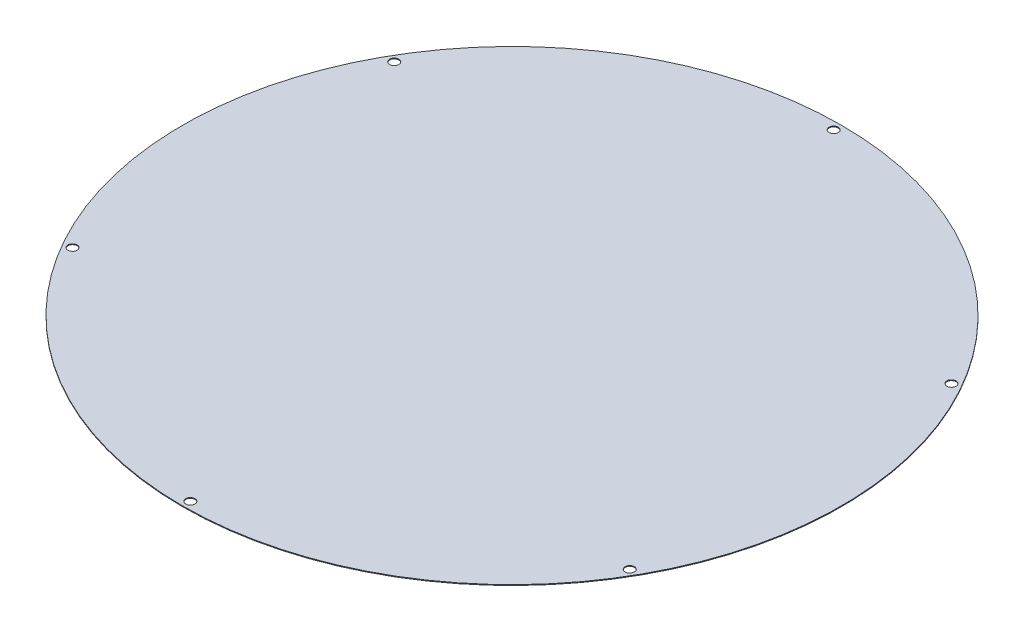
ISO-10303-21;
HEADER;
FILE_DESCRIPTION(('STEP AP214'),'2;1');
FILE_NAME('part.step','',(''),(''),'','','');
FILE_SCHEMA(('AUTOMOTIVE_DESIGN { 1 0 10303 214 1 1 1 1 }'));
ENDSEC;
DATA;
#1=APPLICATION_CONTEXT('core data for automotive mechanical design processes');
#2=APPLICATION_PROTOCOL_DEFINITION('international standard','automotive_design',2000,#1);
#3=PRODUCT_CONTEXT('',#1,'mechanical');
#4=PRODUCT('Part','Part','',(#3));
#5=PRODUCT_RELATED_PRODUCT_CATEGORY('part','',(#4));
#6=PRODUCT_DEFINITION_FORMATION('','',#4);
#7=PRODUCT_DEFINITION_CONTEXT('part definition',#1,'design');
#8=PRODUCT_DEFINITION('design','',#6,#7);
#9=PRODUCT_DEFINITION_SHAPE('','',#8);
#10=(LENGTH_UNIT() NAMED_UNIT(*) SI_UNIT(.MILLI.,.METRE.));
#11=(NAMED_UNIT(*) PLANE_ANGLE_UNIT() SI_UNIT($,.RADIAN.));
#12=(NAMED_UNIT(*) SI_UNIT($,.STERADIAN.) SOLID_ANGLE_UNIT());
#13=UNCERTAINTY_MEASURE_WITH_UNIT(LENGTH_MEASURE(1.E-05),#10,'distance_accuracy_value','');
#14=(GEOMETRIC_REPRESENTATION_CONTEXT(3) GLOBAL_UNCERTAINTY_ASSIGNED_CONTEXT((#13)) GLOBAL_UNIT_ASSIGNED_CONTEXT((#10,
#11,#12)) REPRESENTATION_CONTEXT('',''));
#15=CARTESIAN_POINT('',(0.,0.,0.));
#16=DIRECTION('',(0.,0.,1.));
#17=DIRECTION('',(1.,0.,0.));
#18=AXIS2_PLACEMENT_3D('',#15,#16,#17);
#19=CARTESIAN_POINT('',(0.,0.254,102.5));
#20=DIRECTION('',(0.,-1.,0.));
#21=DIRECTION('',(0.,0.,-1.));
#22=AXIS2_PLACEMENT_3D('',#19,#20,#21);
#23=CYLINDRICAL_SURFACE('',#22,1.4732);
#24=CARTESIAN_POINT('',(0.,0.254,102.5));
#25=DIRECTION('',(0.,1.,0.));
#26=DIRECTION('',(0.,0.,1.));
#27=AXIS2_PLACEMENT_3D('',#24,#25,#26);
#28=CIRCLE('',#27,1.4732);
#29=CARTESIAN_POINT('',(0.,0.254,103.9732));
#30=VERTEX_POINT('',#29);
#31=EDGE_CURVE('E43',#30,#30,#28,.T.);
#32=ORIENTED_EDGE('',*,*,#31,.T.);
#33=EDGE_LOOP('',(#32));
#34=FACE_BOUND('',#33,.T.);
#35=CARTESIAN_POINT('',(0.,0.,102.5));
#36=DIRECTION('',(0.,1.,0.));
#37=DIRECTION('',(0.,0.,1.));
#38=AXIS2_PLACEMENT_3D('',#35,#36,#37);
#39=CIRCLE('',#38,1.4732);
#40=CARTESIAN_POINT('',(0.,0.,103.9732));
#41=VERTEX_POINT('',#40);
#42=EDGE_CURVE('E68',#41,#41,#39,.T.);
#43=ORIENTED_EDGE('',*,*,#42,.F.);
#44=EDGE_LOOP('',(#43));
#45=FACE_BOUND('',#44,.T.);
#46=ADVANCED_FACE('F34',(#34,#45),#23,.F.);
#47=CARTESIAN_POINT('',(-88.7671038879051,0.254,51.249133974596));
#48=DIRECTION('',(0.,-1.,0.));
#49=DIRECTION('',(0.,0.,-1.));
#50=AXIS2_PLACEMENT_3D('',#47,#48,#49);
#51=CYLINDRICAL_SURFACE('',#50,1.47320000000002);
#52=CARTESIAN_POINT('',(-88.7671038879051,0.254,51.249133974596));
#53=DIRECTION('',(0.,1.,0.));
#54=DIRECTION('',(0.,0.,1.));
#55=AXIS2_PLACEMENT_3D('',#52,#53,#54);
#56=CIRCLE('',#55,1.47320000000002);
#57=CARTESIAN_POINT('',(-88.7671038879051,0.254,52.722333974596));
#58=VERTEX_POINT('',#57);
#59=EDGE_CURVE('E50',#58,#58,#56,.T.);
#60=ORIENTED_EDGE('',*,*,#59,.T.);
#61=EDGE_LOOP('',(#60));
#62=FACE_BOUND('',#61,.T.);
#63=CARTESIAN_POINT('',(-88.7671038879051,0.,51.249133974596));
#64=DIRECTION('',(0.,1.,0.));
#65=DIRECTION('',(0.,0.,1.));
#66=AXIS2_PLACEMENT_3D('',#63,#64,#65);
#67=CIRCLE('',#66,1.47320000000002);
#68=CARTESIAN_POINT('',(-88.7671038879051,0.,52.722333974596));
#69=VERTEX_POINT('',#68);
#70=EDGE_CURVE('E66',#69,#69,#67,.T.);
#71=ORIENTED_EDGE('',*,*,#70,.F.);
#72=EDGE_LOOP('',(#71));
#73=FACE_BOUND('',#72,.T.);
#74=ADVANCED_FACE('F93',(#62,#73),#51,.F.);
#75=CARTESIAN_POINT('',(-88.7661038879047,0.254,-51.2508660254042));
#76=DIRECTION('',(0.,-1.,0.));
#77=DIRECTION('',(0.,0.,-1.));
#78=AXIS2_PLACEMENT_3D('',#75,#76,#77);
#79=CYLINDRICAL_SURFACE('',#78,1.4732);
#80=CARTESIAN_POINT('',(-88.7661038879047,0.254,-51.2508660254042));
#81=DIRECTION('',(0.,1.,0.));
#82=DIRECTION('',(0.,0.,1.));
#83=AXIS2_PLACEMENT_3D('',#80,#81,#82);
#84=CIRCLE('',#83,1.4732);
#85=CARTESIAN_POINT('',(-88.7661038879047,0.254,-49.7776660254042));
#86=VERTEX_POINT('',#85);
#87=EDGE_CURVE('E88',#86,#86,#84,.T.);
#88=ORIENTED_EDGE('',*,*,#87,.T.);
#89=EDGE_LOOP('',(#88));
#90=FACE_BOUND('',#89,.T.);
#91=CARTESIAN_POINT('',(-88.7661038879047,0.,-51.2508660254042));
#92=DIRECTION('',(0.,1.,0.));
#93=DIRECTION('',(0.,0.,1.));
#94=AXIS2_PLACEMENT_3D('',#91,#92,#93);
#95=CIRCLE('',#94,1.4732);
#96=CARTESIAN_POINT('',(-88.7661038879047,0.,-49.7776660254042));
#97=VERTEX_POINT('',#96);
#98=EDGE_CURVE('E63',#97,#97,#95,.T.);
#99=ORIENTED_EDGE('',*,*,#98,.F.);
#100=EDGE_LOOP('',(#99));
#101=FACE_BOUND('',#100,.T.);
#102=ADVANCED_FACE('F111',(#90,#101),#79,.F.);
#103=CARTESIAN_POINT('',(0.00200000000073714,0.254,-102.5));
#104=DIRECTION('',(0.,-1.,0.));
#105=DIRECTION('',(0.,0.,-1.));
#106=AXIS2_PLACEMENT_3D('',#103,#104,#105);
#107=CYLINDRICAL_SURFACE('',#106,1.4732);
#108=CARTESIAN_POINT('',(0.00200000000073714,0.254,-102.5));
#109=DIRECTION('',(0.,1.,0.));
#110=DIRECTION('',(0.,0.,1.));
#111=AXIS2_PLACEMENT_3D('',#108,#109,#110);
#112=CIRCLE('',#111,1.4732);
#113=CARTESIAN_POINT('',(0.00200000000073714,0.254,-101.0268));
#114=VERTEX_POINT('',#113);
#115=EDGE_CURVE('E83',#114,#114,#112,.T.);
#116=ORIENTED_EDGE('',*,*,#115,.T.);
#117=EDGE_LOOP('',(#116));
#118=FACE_BOUND('',#117,.T.);
#119=CARTESIAN_POINT('',(0.00200000000073714,0.,-102.5));
#120=DIRECTION('',(0.,1.,0.));
#121=DIRECTION('',(0.,0.,1.));
#122=AXIS2_PLACEMENT_3D('',#119,#120,#121);
#123=CIRCLE('',#122,1.4732);
#124=CARTESIAN_POINT('',(0.00200000000073714,0.,-101.0268));
#125=VERTEX_POINT('',#124);
#126=EDGE_CURVE('E60',#125,#125,#123,.T.);
#127=ORIENTED_EDGE('',*,*,#126,.F.);
#128=EDGE_LOOP('',(#127));
#129=FACE_BOUND('',#128,.T.);
#130=ADVANCED_FACE('F118',(#118,#129),#107,.F.);
#131=CARTESIAN_POINT('',(88.7691038879054,0.254,-51.2491339745954));
#132=DIRECTION('',(0.,-1.,0.));
#133=DIRECTION('',(0.,0.,-1.));
#134=AXIS2_PLACEMENT_3D('',#131,#132,#133);
#135=CYLINDRICAL_SURFACE('',#134,1.4732);
#136=CARTESIAN_POINT('',(88.7691038879054,0.254,-51.2491339745954));
#137=DIRECTION('',(0.,1.,0.));
#138=DIRECTION('',(0.,0.,1.));
#139=AXIS2_PLACEMENT_3D('',#136,#137,#138);
#140=CIRCLE('',#139,1.4732);
#141=CARTESIAN_POINT('',(88.7691038879054,0.254,-49.7759339745954));
#142=VERTEX_POINT('',#141);
#143=EDGE_CURVE('E78',#142,#142,#140,.T.);
#144=ORIENTED_EDGE('',*,*,#143,.T.);
#145=EDGE_LOOP('',(#144));
#146=FACE_BOUND('',#145,.T.);
#147=CARTESIAN_POINT('',(88.7691038879054,0.,-51.2491339745954));
#148=DIRECTION('',(0.,1.,0.));
#149=DIRECTION('',(0.,0.,1.));
#150=AXIS2_PLACEMENT_3D('',#147,#148,#149);
#151=CIRCLE('',#150,1.4732);
#152=CARTESIAN_POINT('',(88.7691038879054,0.,-49.7759339745954));
#153=VERTEX_POINT('',#152);
#154=EDGE_CURVE('E57',#153,#153,#151,.T.);
#155=ORIENTED_EDGE('',*,*,#154,.F.);
#156=EDGE_LOOP('',(#155));
#157=FACE_BOUND('',#156,.T.);
#158=ADVANCED_FACE('F121',(#146,#157),#135,.F.);
#159=CARTESIAN_POINT('',(88.7681038879043,0.254,51.2508660254048));
#160=DIRECTION('',(0.,-1.,0.));
#161=DIRECTION('',(0.,0.,-1.));
#162=AXIS2_PLACEMENT_3D('',#159,#160,#161);
#163=CYLINDRICAL_SURFACE('',#162,1.47319999999999);
#164=CARTESIAN_POINT('',(88.7681038879043,0.254,51.2508660254048));
#165=DIRECTION('',(0.,1.,0.));
#166=DIRECTION('',(0.,0.,1.));
#167=AXIS2_PLACEMENT_3D('',#164,#165,#166);
#168=CIRCLE('',#167,1.47319999999999);
#169=CARTESIAN_POINT('',(88.7681038879043,0.254,52.7240660254048));
#170=VERTEX_POINT('',#169);
#171=EDGE_CURVE('E74',#170,#170,#168,.T.);
#172=ORIENTED_EDGE('',*,*,#171,.T.);
#173=EDGE_LOOP('',(#172));
#174=FACE_BOUND('',#173,.T.);
#175=CARTESIAN_POINT('',(88.7681038879043,0.,51.2508660254048));
#176=DIRECTION('',(0.,1.,0.));
#177=DIRECTION('',(0.,0.,1.));
#178=AXIS2_PLACEMENT_3D('',#175,#176,#177);
#179=CIRCLE('',#178,1.47319999999999);
#180=CARTESIAN_POINT('',(88.7681038879043,0.,52.7240660254048));
#181=VERTEX_POINT('',#180);
#182=EDGE_CURVE('E54',#181,#181,#179,.T.);
#183=ORIENTED_EDGE('',*,*,#182,.F.);
#184=EDGE_LOOP('',(#183));
#185=FACE_BOUND('',#184,.T.);
#186=ADVANCED_FACE('F36',(#174,#185),#163,.F.);
#187=CARTESIAN_POINT('',(0.,0.254,0.));
#188=DIRECTION('',(0.,-1.,0.));
#189=DIRECTION('',(0.,0.,-1.));
#190=AXIS2_PLACEMENT_3D('',#187,#188,#189);
#191=CYLINDRICAL_SURFACE('',#190,105.);
#192=CARTESIAN_POINT('',(0.,0.254,0.));
#193=DIRECTION('',(0.,1.,0.));
#194=DIRECTION('',(0.,0.,1.));
#195=AXIS2_PLACEMENT_3D('',#192,#193,#194);
#196=CIRCLE('',#195,105.);
#197=CARTESIAN_POINT('',(0.,0.254,105.));
#198=VERTEX_POINT('',#197);
#199=EDGE_CURVE('E10',#198,#198,#196,.T.);
#200=ORIENTED_EDGE('',*,*,#199,.F.);
#201=EDGE_LOOP('',(#200));
#202=FACE_BOUND('',#201,.T.);
#203=CARTESIAN_POINT('',(0.,0.,0.));
#204=DIRECTION('',(0.,1.,0.));
#205=DIRECTION('',(0.,0.,1.));
#206=AXIS2_PLACEMENT_3D('',#203,#204,#205);
#207=CIRCLE('',#206,105.);
#208=CARTESIAN_POINT('',(0.,0.,105.));
#209=VERTEX_POINT('',#208);
#210=EDGE_CURVE('E38',#209,#209,#207,.T.);
#211=ORIENTED_EDGE('',*,*,#210,.T.);
#212=EDGE_LOOP('',(#211));
#213=FACE_BOUND('',#212,.T.);
#214=ADVANCED_FACE('F100',(#202,#213),#191,.T.);
#215=CARTESIAN_POINT('',(-231.141421356237,0.254,0.));
#216=DIRECTION('',(0.,1.,0.));
#217=DIRECTION('',(0.,0.,1.));
#218=AXIS2_PLACEMENT_3D('',#215,#216,#217);
#219=PLANE('',#218);
#220=ORIENTED_EDGE('',*,*,#171,.F.);
#221=EDGE_LOOP('',(#220));
#222=FACE_BOUND('',#221,.T.);
#223=ORIENTED_EDGE('',*,*,#143,.F.);
#224=EDGE_LOOP('',(#223));
#225=FACE_BOUND('',#224,.T.);
#226=ORIENTED_EDGE('',*,*,#115,.F.);
#227=EDGE_LOOP('',(#226));
#228=FACE_BOUND('',#227,.T.);
#229=ORIENTED_EDGE('',*,*,#87,.F.);
#230=EDGE_LOOP('',(#229));
#231=FACE_BOUND('',#230,.T.);
#232=ORIENTED_EDGE('',*,*,#59,.F.);
#233=EDGE_LOOP('',(#232));
#234=FACE_BOUND('',#233,.T.);
#235=ORIENTED_EDGE('',*,*,#31,.F.);
#236=EDGE_LOOP('',(#235));
#237=FACE_BOUND('',#236,.T.);
#238=ORIENTED_EDGE('',*,*,#199,.T.);
#239=EDGE_LOOP('',(#238));
#240=FACE_BOUND('',#239,.T.);
#241=ADVANCED_FACE('F96',(#222,#225,#228,#231,#234,#237,#240),#219,.T.);
#242=CARTESIAN_POINT('',(-231.141421356237,0.,0.));
#243=DIRECTION('',(0.,1.,0.));
#244=DIRECTION('',(0.,0.,1.));
#245=AXIS2_PLACEMENT_3D('',#242,#243,#244);
#246=PLANE('',#245);
#247=ORIENTED_EDGE('',*,*,#182,.T.);
#248=EDGE_LOOP('',(#247));
#249=FACE_BOUND('',#248,.T.);
#250=ORIENTED_EDGE('',*,*,#154,.T.);
#251=EDGE_LOOP('',(#250));
#252=FACE_BOUND('',#251,.T.);
#253=ORIENTED_EDGE('',*,*,#126,.T.);
#254=EDGE_LOOP('',(#253));
#255=FACE_BOUND('',#254,.T.);
#256=ORIENTED_EDGE('',*,*,#98,.T.);
#257=EDGE_LOOP('',(#256));
#258=FACE_BOUND('',#257,.T.);
#259=ORIENTED_EDGE('',*,*,#70,.T.);
#260=EDGE_LOOP('',(#259));
#261=FACE_BOUND('',#260,.T.);
#262=ORIENTED_EDGE('',*,*,#42,.T.);
#263=EDGE_LOOP('',(#262));
#264=FACE_BOUND('',#263,.T.);
#265=ORIENTED_EDGE('',*,*,#210,.F.);
#266=EDGE_LOOP('',(#265));
#267=FACE_BOUND('',#266,.T.);
#268=ADVANCED_FACE('F99',(#249,#252,#255,#258,#261,#264,#267),#246,.F.);
#269=CLOSED_SHELL('',(#46,#74,#102,#130,#158,#186,#214,#241,#268));
#270=MANIFOLD_SOLID_BREP('B2',#269);
#271=ADVANCED_BREP_SHAPE_REPRESENTATION('',(#18,#270),#14);
#272=SHAPE_DEFINITION_REPRESENTATION(#9,#271);
ENDSEC;
END-ISO-10303-21;
